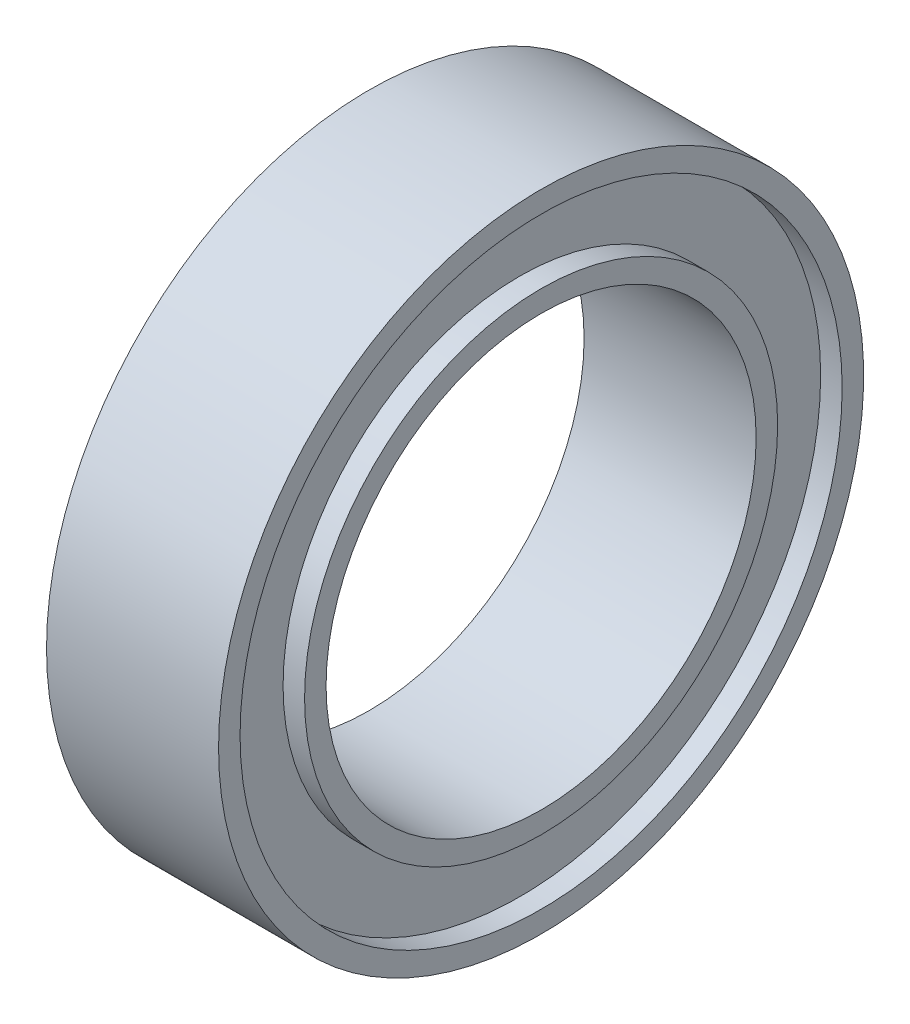
ISO-10303-21;
HEADER;
FILE_DESCRIPTION(('STEP AP214'),'2;1');
FILE_NAME('part.step','',(''),(''),'','','');
FILE_SCHEMA(('AUTOMOTIVE_DESIGN { 1 0 10303 214 1 1 1 1 }'));
ENDSEC;
DATA;
#1=APPLICATION_CONTEXT('core data for automotive mechanical design processes');
#2=APPLICATION_PROTOCOL_DEFINITION('international standard','automotive_design',2000,#1);
#3=PRODUCT_CONTEXT('',#1,'mechanical');
#4=PRODUCT('Part','Part','',(#3));
#5=PRODUCT_RELATED_PRODUCT_CATEGORY('part','',(#4));
#6=PRODUCT_DEFINITION_FORMATION('','',#4);
#7=PRODUCT_DEFINITION_CONTEXT('part definition',#1,'design');
#8=PRODUCT_DEFINITION('design','',#6,#7);
#9=PRODUCT_DEFINITION_SHAPE('','',#8);
#10=(LENGTH_UNIT() NAMED_UNIT(*) SI_UNIT(.MILLI.,.METRE.));
#11=(NAMED_UNIT(*) PLANE_ANGLE_UNIT() SI_UNIT($,.RADIAN.));
#12=(NAMED_UNIT(*) SI_UNIT($,.STERADIAN.) SOLID_ANGLE_UNIT());
#13=UNCERTAINTY_MEASURE_WITH_UNIT(LENGTH_MEASURE(1.E-05),#10,'distance_accuracy_value','');
#14=(GEOMETRIC_REPRESENTATION_CONTEXT(3) GLOBAL_UNCERTAINTY_ASSIGNED_CONTEXT((#13)) GLOBAL_UNIT_ASSIGNED_CONTEXT((#10,
#11,#12)) REPRESENTATION_CONTEXT('',''));
#15=CARTESIAN_POINT('',(0.,0.,0.));
#16=DIRECTION('',(0.,0.,1.));
#17=DIRECTION('',(1.,0.,0.));
#18=AXIS2_PLACEMENT_3D('',#15,#16,#17);
#19=CARTESIAN_POINT('',(2.,7.,0.));
#20=DIRECTION('',(-1.,0.,0.));
#21=DIRECTION('',(0.,0.,1.));
#22=AXIS2_PLACEMENT_3D('',#19,#20,#21);
#23=PLANE('',#22);
#24=CARTESIAN_POINT('',(2.,0.,0.));
#25=DIRECTION('',(-1.,0.,0.));
#26=DIRECTION('',(0.,0.,1.));
#27=AXIS2_PLACEMENT_3D('',#24,#25,#26);
#28=CIRCLE('',#27,7.5);
#29=CARTESIAN_POINT('',(2.,0.,7.5));
#30=VERTEX_POINT('',#29);
#31=EDGE_CURVE('E71',#30,#30,#28,.T.);
#32=ORIENTED_EDGE('',*,*,#31,.F.);
#33=EDGE_LOOP('',(#32));
#34=FACE_BOUND('',#33,.T.);
#35=CARTESIAN_POINT('',(2.,0.,0.));
#36=DIRECTION('',(-1.,0.,0.));
#37=DIRECTION('',(0.,0.,1.));
#38=AXIS2_PLACEMENT_3D('',#35,#36,#37);
#39=CIRCLE('',#38,7.);
#40=CARTESIAN_POINT('',(2.,0.,7.));
#41=VERTEX_POINT('',#40);
#42=EDGE_CURVE('E10',#41,#41,#39,.T.);
#43=ORIENTED_EDGE('',*,*,#42,.T.);
#44=EDGE_LOOP('',(#43));
#45=FACE_BOUND('',#44,.T.);
#46=ADVANCED_FACE('F31',(#34,#45),#23,.F.);
#47=CARTESIAN_POINT('',(-31.5428203910579,0.,0.));
#48=DIRECTION('',(-1.,0.,0.));
#49=DIRECTION('',(0.,0.,1.));
#50=AXIS2_PLACEMENT_3D('',#47,#48,#49);
#51=CYLINDRICAL_SURFACE('',#50,7.);
#52=ORIENTED_EDGE('',*,*,#42,.F.);
#53=EDGE_LOOP('',(#52));
#54=FACE_BOUND('',#53,.T.);
#55=CARTESIAN_POINT('',(1.5,0.,0.));
#56=DIRECTION('',(-1.,0.,0.));
#57=DIRECTION('',(0.,0.,1.));
#58=AXIS2_PLACEMENT_3D('',#55,#56,#57);
#59=CIRCLE('',#58,7.);
#60=CARTESIAN_POINT('',(1.5,0.,7.));
#61=VERTEX_POINT('',#60);
#62=EDGE_CURVE('E37',#61,#61,#59,.T.);
#63=ORIENTED_EDGE('',*,*,#62,.T.);
#64=EDGE_LOOP('',(#63));
#65=FACE_BOUND('',#64,.T.);
#66=ADVANCED_FACE('F78',(#54,#65),#51,.F.);
#67=CARTESIAN_POINT('',(1.5,5.5,0.));
#68=DIRECTION('',(-1.,0.,0.));
#69=DIRECTION('',(0.,0.,1.));
#70=AXIS2_PLACEMENT_3D('',#67,#68,#69);
#71=PLANE('',#70);
#72=ORIENTED_EDGE('',*,*,#62,.F.);
#73=EDGE_LOOP('',(#72));
#74=FACE_BOUND('',#73,.T.);
#75=CARTESIAN_POINT('',(1.5,0.,0.));
#76=DIRECTION('',(-1.,0.,0.));
#77=DIRECTION('',(0.,0.,1.));
#78=AXIS2_PLACEMENT_3D('',#75,#76,#77);
#79=CIRCLE('',#78,5.5);
#80=CARTESIAN_POINT('',(1.5,0.,5.5));
#81=VERTEX_POINT('',#80);
#82=EDGE_CURVE('E41',#81,#81,#79,.T.);
#83=ORIENTED_EDGE('',*,*,#82,.T.);
#84=EDGE_LOOP('',(#83));
#85=FACE_BOUND('',#84,.T.);
#86=ADVANCED_FACE('F82',(#74,#85),#71,.F.);
#87=CARTESIAN_POINT('',(-31.5428203910579,0.,0.));
#88=DIRECTION('',(-1.,0.,0.));
#89=DIRECTION('',(0.,0.,1.));
#90=AXIS2_PLACEMENT_3D('',#87,#88,#89);
#91=CYLINDRICAL_SURFACE('',#90,5.5);
#92=ORIENTED_EDGE('',*,*,#82,.F.);
#93=EDGE_LOOP('',(#92));
#94=FACE_BOUND('',#93,.T.);
#95=CARTESIAN_POINT('',(2.,0.,0.));
#96=DIRECTION('',(-1.,0.,0.));
#97=DIRECTION('',(0.,0.,1.));
#98=AXIS2_PLACEMENT_3D('',#95,#96,#97);
#99=CIRCLE('',#98,5.5);
#100=CARTESIAN_POINT('',(2.,0.,5.5));
#101=VERTEX_POINT('',#100);
#102=EDGE_CURVE('E45',#101,#101,#99,.T.);
#103=ORIENTED_EDGE('',*,*,#102,.T.);
#104=EDGE_LOOP('',(#103));
#105=FACE_BOUND('',#104,.T.);
#106=ADVANCED_FACE('F87',(#94,#105),#91,.T.);
#107=CARTESIAN_POINT('',(2.,5.,0.));
#108=DIRECTION('',(-1.,0.,0.));
#109=DIRECTION('',(0.,0.,1.));
#110=AXIS2_PLACEMENT_3D('',#107,#108,#109);
#111=PLANE('',#110);
#112=ORIENTED_EDGE('',*,*,#102,.F.);
#113=EDGE_LOOP('',(#112));
#114=FACE_BOUND('',#113,.T.);
#115=CARTESIAN_POINT('',(2.,0.,0.));
#116=DIRECTION('',(-1.,0.,0.));
#117=DIRECTION('',(0.,0.,1.));
#118=AXIS2_PLACEMENT_3D('',#115,#116,#117);
#119=CIRCLE('',#118,5.);
#120=CARTESIAN_POINT('',(2.,0.,5.));
#121=VERTEX_POINT('',#120);
#122=EDGE_CURVE('E50',#121,#121,#119,.T.);
#123=ORIENTED_EDGE('',*,*,#122,.T.);
#124=EDGE_LOOP('',(#123));
#125=FACE_BOUND('',#124,.T.);
#126=ADVANCED_FACE('F93',(#114,#125),#111,.F.);
#127=CARTESIAN_POINT('',(-31.5428203910579,0.,0.));
#128=DIRECTION('',(-1.,0.,0.));
#129=DIRECTION('',(0.,0.,1.));
#130=AXIS2_PLACEMENT_3D('',#127,#128,#129);
#131=CYLINDRICAL_SURFACE('',#130,5.);
#132=ORIENTED_EDGE('',*,*,#122,.F.);
#133=EDGE_LOOP('',(#132));
#134=FACE_BOUND('',#133,.T.);
#135=CARTESIAN_POINT('',(-2.,0.,0.));
#136=DIRECTION('',(-1.,0.,0.));
#137=DIRECTION('',(0.,0.,1.));
#138=AXIS2_PLACEMENT_3D('',#135,#136,#137);
#139=CIRCLE('',#138,5.);
#140=CARTESIAN_POINT('',(-2.,0.,5.));
#141=VERTEX_POINT('',#140);
#142=EDGE_CURVE('E53',#141,#141,#139,.T.);
#143=ORIENTED_EDGE('',*,*,#142,.T.);
#144=EDGE_LOOP('',(#143));
#145=FACE_BOUND('',#144,.T.);
#146=ADVANCED_FACE('F97',(#134,#145),#131,.F.);
#147=CARTESIAN_POINT('',(-2.,5.,0.));
#148=DIRECTION('',(1.,0.,0.));
#149=DIRECTION('',(0.,0.,-1.));
#150=AXIS2_PLACEMENT_3D('',#147,#148,#149);
#151=PLANE('',#150);
#152=ORIENTED_EDGE('',*,*,#142,.F.);
#153=EDGE_LOOP('',(#152));
#154=FACE_BOUND('',#153,.T.);
#155=CARTESIAN_POINT('',(-2.,0.,0.));
#156=DIRECTION('',(-1.,0.,0.));
#157=DIRECTION('',(0.,0.,1.));
#158=AXIS2_PLACEMENT_3D('',#155,#156,#157);
#159=CIRCLE('',#158,5.5);
#160=CARTESIAN_POINT('',(-2.,0.,5.5));
#161=VERTEX_POINT('',#160);
#162=EDGE_CURVE('E56',#161,#161,#159,.T.);
#163=ORIENTED_EDGE('',*,*,#162,.T.);
#164=EDGE_LOOP('',(#163));
#165=FACE_BOUND('',#164,.T.);
#166=ADVANCED_FACE('F101',(#154,#165),#151,.F.);
#167=CARTESIAN_POINT('',(-31.5428203910579,0.,0.));
#168=DIRECTION('',(-1.,0.,0.));
#169=DIRECTION('',(0.,0.,1.));
#170=AXIS2_PLACEMENT_3D('',#167,#168,#169);
#171=CYLINDRICAL_SURFACE('',#170,5.5);
#172=ORIENTED_EDGE('',*,*,#162,.F.);
#173=EDGE_LOOP('',(#172));
#174=FACE_BOUND('',#173,.T.);
#175=CARTESIAN_POINT('',(-1.5,0.,0.));
#176=DIRECTION('',(-1.,0.,0.));
#177=DIRECTION('',(0.,0.,1.));
#178=AXIS2_PLACEMENT_3D('',#175,#176,#177);
#179=CIRCLE('',#178,5.5);
#180=CARTESIAN_POINT('',(-1.5,0.,5.5));
#181=VERTEX_POINT('',#180);
#182=EDGE_CURVE('E59',#181,#181,#179,.T.);
#183=ORIENTED_EDGE('',*,*,#182,.T.);
#184=EDGE_LOOP('',(#183));
#185=FACE_BOUND('',#184,.T.);
#186=ADVANCED_FACE('F105',(#174,#185),#171,.T.);
#187=CARTESIAN_POINT('',(-1.5,5.5,0.));
#188=DIRECTION('',(1.,0.,0.));
#189=DIRECTION('',(0.,0.,-1.));
#190=AXIS2_PLACEMENT_3D('',#187,#188,#189);
#191=PLANE('',#190);
#192=ORIENTED_EDGE('',*,*,#182,.F.);
#193=EDGE_LOOP('',(#192));
#194=FACE_BOUND('',#193,.T.);
#195=CARTESIAN_POINT('',(-1.5,0.,0.));
#196=DIRECTION('',(-1.,0.,0.));
#197=DIRECTION('',(0.,0.,1.));
#198=AXIS2_PLACEMENT_3D('',#195,#196,#197);
#199=CIRCLE('',#198,7.);
#200=CARTESIAN_POINT('',(-1.5,0.,7.));
#201=VERTEX_POINT('',#200);
#202=EDGE_CURVE('E62',#201,#201,#199,.T.);
#203=ORIENTED_EDGE('',*,*,#202,.T.);
#204=EDGE_LOOP('',(#203));
#205=FACE_BOUND('',#204,.T.);
#206=ADVANCED_FACE('F109',(#194,#205),#191,.F.);
#207=CARTESIAN_POINT('',(-31.5428203910579,0.,0.));
#208=DIRECTION('',(-1.,0.,0.));
#209=DIRECTION('',(0.,0.,1.));
#210=AXIS2_PLACEMENT_3D('',#207,#208,#209);
#211=CYLINDRICAL_SURFACE('',#210,7.);
#212=ORIENTED_EDGE('',*,*,#202,.F.);
#213=EDGE_LOOP('',(#212));
#214=FACE_BOUND('',#213,.T.);
#215=CARTESIAN_POINT('',(-2.,0.,0.));
#216=DIRECTION('',(-1.,0.,0.));
#217=DIRECTION('',(0.,0.,1.));
#218=AXIS2_PLACEMENT_3D('',#215,#216,#217);
#219=CIRCLE('',#218,7.);
#220=CARTESIAN_POINT('',(-2.,0.,7.));
#221=VERTEX_POINT('',#220);
#222=EDGE_CURVE('E65',#221,#221,#219,.T.);
#223=ORIENTED_EDGE('',*,*,#222,.T.);
#224=EDGE_LOOP('',(#223));
#225=FACE_BOUND('',#224,.T.);
#226=ADVANCED_FACE('F113',(#214,#225),#211,.F.);
#227=CARTESIAN_POINT('',(-2.,7.,0.));
#228=DIRECTION('',(1.,0.,0.));
#229=DIRECTION('',(0.,0.,-1.));
#230=AXIS2_PLACEMENT_3D('',#227,#228,#229);
#231=PLANE('',#230);
#232=ORIENTED_EDGE('',*,*,#222,.F.);
#233=EDGE_LOOP('',(#232));
#234=FACE_BOUND('',#233,.T.);
#235=CARTESIAN_POINT('',(-2.,0.,0.));
#236=DIRECTION('',(-1.,0.,0.));
#237=DIRECTION('',(0.,0.,1.));
#238=AXIS2_PLACEMENT_3D('',#235,#236,#237);
#239=CIRCLE('',#238,7.5);
#240=CARTESIAN_POINT('',(-2.,0.,7.5));
#241=VERTEX_POINT('',#240);
#242=EDGE_CURVE('E68',#241,#241,#239,.T.);
#243=ORIENTED_EDGE('',*,*,#242,.T.);
#244=EDGE_LOOP('',(#243));
#245=FACE_BOUND('',#244,.T.);
#246=ADVANCED_FACE('F117',(#234,#245),#231,.F.);
#247=CARTESIAN_POINT('',(-31.5428203910579,0.,0.));
#248=DIRECTION('',(-1.,0.,0.));
#249=DIRECTION('',(0.,0.,1.));
#250=AXIS2_PLACEMENT_3D('',#247,#248,#249);
#251=CYLINDRICAL_SURFACE('',#250,7.5);
#252=ORIENTED_EDGE('',*,*,#242,.F.);
#253=EDGE_LOOP('',(#252));
#254=FACE_BOUND('',#253,.T.);
#255=ORIENTED_EDGE('',*,*,#31,.T.);
#256=EDGE_LOOP('',(#255));
#257=FACE_BOUND('',#256,.T.);
#258=ADVANCED_FACE('F75',(#254,#257),#251,.T.);
#259=CLOSED_SHELL('',(#46,#66,#86,#106,#126,#146,#166,#186,#206,#226,#246,#258));
#260=MANIFOLD_SOLID_BREP('B2',#259);
#261=ADVANCED_BREP_SHAPE_REPRESENTATION('',(#18,#260),#14);
#262=SHAPE_DEFINITION_REPRESENTATION(#9,#261);
ENDSEC;
END-ISO-10303-21;
